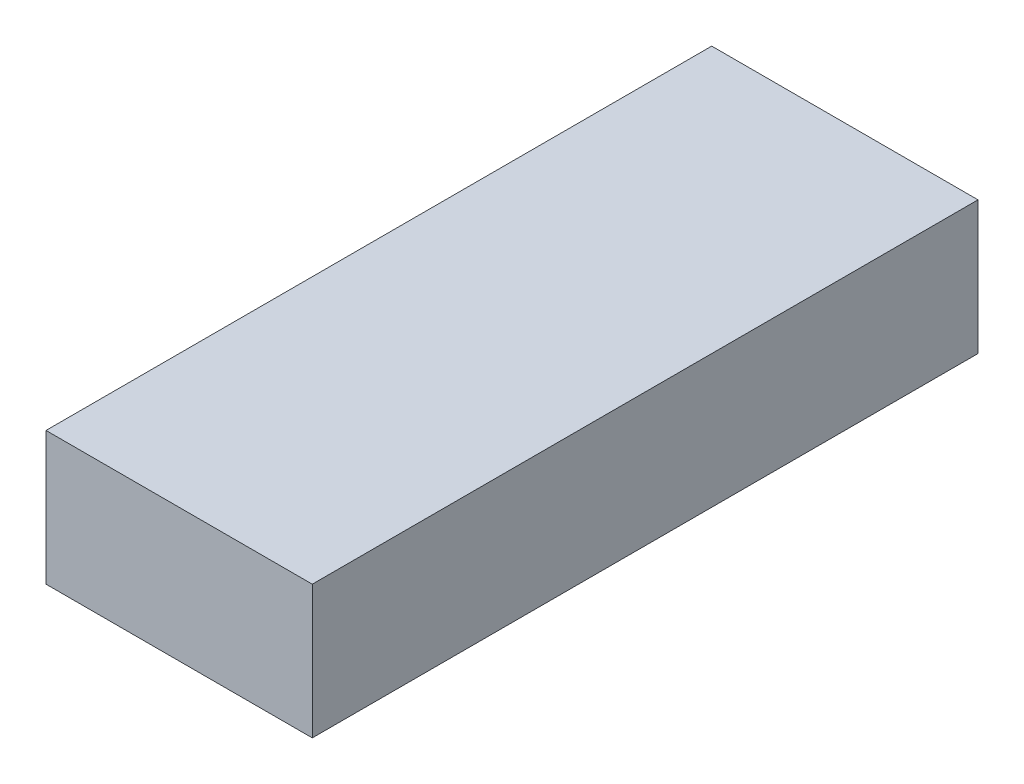
ISO-10303-21;
HEADER;
FILE_DESCRIPTION(('STEP AP214'),'2;1');
FILE_NAME('part.step','',(''),(''),'','','');
FILE_SCHEMA(('AUTOMOTIVE_DESIGN { 1 0 10303 214 1 1 1 1 }'));
ENDSEC;
DATA;
#1=APPLICATION_CONTEXT('core data for automotive mechanical design processes');
#2=APPLICATION_PROTOCOL_DEFINITION('international standard','automotive_design',2000,#1);
#3=PRODUCT_CONTEXT('',#1,'mechanical');
#4=PRODUCT('Part','Part','',(#3));
#5=PRODUCT_RELATED_PRODUCT_CATEGORY('part','',(#4));
#6=PRODUCT_DEFINITION_FORMATION('','',#4);
#7=PRODUCT_DEFINITION_CONTEXT('part definition',#1,'design');
#8=PRODUCT_DEFINITION('design','',#6,#7);
#9=PRODUCT_DEFINITION_SHAPE('','',#8);
#10=(LENGTH_UNIT() NAMED_UNIT(*) SI_UNIT(.MILLI.,.METRE.));
#11=(NAMED_UNIT(*) PLANE_ANGLE_UNIT() SI_UNIT($,.RADIAN.));
#12=(NAMED_UNIT(*) SI_UNIT($,.STERADIAN.) SOLID_ANGLE_UNIT());
#13=UNCERTAINTY_MEASURE_WITH_UNIT(LENGTH_MEASURE(1.E-05),#10,'distance_accuracy_value','');
#14=(GEOMETRIC_REPRESENTATION_CONTEXT(3) GLOBAL_UNCERTAINTY_ASSIGNED_CONTEXT((#13)) GLOBAL_UNIT_ASSIGNED_CONTEXT((#10,
#11,#12)) REPRESENTATION_CONTEXT('',''));
#15=CARTESIAN_POINT('',(0.,0.,0.));
#16=DIRECTION('',(0.,0.,1.));
#17=DIRECTION('',(1.,0.,0.));
#18=AXIS2_PLACEMENT_3D('',#15,#16,#17);
#19=CARTESIAN_POINT('',(-1.11022302462516E-13,6.34999999999999,0.));
#20=DIRECTION('',(1.,0.,0.));
#21=DIRECTION('',(0.,0.,-1.));
#22=AXIS2_PLACEMENT_3D('',#19,#20,#21);
#23=PLANE('',#22);
#24=DIRECTION('',(0.,0.,1.));
#25=VECTOR('',#24,1.);
#26=CARTESIAN_POINT('',(0.,0.,0.));
#27=LINE('',#26,#25);
#28=CARTESIAN_POINT('',(0.,0.,-304.8));
#29=VERTEX_POINT('',#28);
#30=CARTESIAN_POINT('',(0.,0.,-273.05));
#31=VERTEX_POINT('',#30);
#32=EDGE_CURVE('E99',#29,#31,#27,.T.);
#33=ORIENTED_EDGE('',*,*,#32,.T.);
#34=DIRECTION('',(0.,1.,0.));
#35=VECTOR('',#34,1.);
#36=CARTESIAN_POINT('',(0.,0.,-273.05));
#37=LINE('',#36,#35);
#38=CARTESIAN_POINT('',(0.,6.34999999999999,-273.05));
#39=VERTEX_POINT('',#38);
#40=EDGE_CURVE('E48',#31,#39,#37,.T.);
#41=ORIENTED_EDGE('',*,*,#40,.T.);
#42=DIRECTION('',(0.,0.,1.));
#43=VECTOR('',#42,1.);
#44=CARTESIAN_POINT('',(-1.11022302462516E-13,6.34999999999999,0.));
#45=LINE('',#44,#43);
#46=CARTESIAN_POINT('',(0.,6.34999999999999,-304.8));
#47=VERTEX_POINT('',#46);
#48=EDGE_CURVE('E101',#47,#39,#45,.T.);
#49=ORIENTED_EDGE('',*,*,#48,.F.);
#50=DIRECTION('',(0.,-1.,0.));
#51=VECTOR('',#50,1.);
#52=CARTESIAN_POINT('',(0.,6.34999999999999,-304.8));
#53=LINE('',#52,#51);
#54=EDGE_CURVE('E11',#47,#29,#53,.T.);
#55=ORIENTED_EDGE('',*,*,#54,.T.);
#56=EDGE_LOOP('',(#33,#41,#49,#55));
#57=FACE_BOUND('',#56,.T.);
#58=ADVANCED_FACE('F34',(#57),#23,.F.);
#59=CARTESIAN_POINT('',(0.,6.34999999999999,-304.8));
#60=DIRECTION('',(0.,0.,1.));
#61=DIRECTION('',(1.,0.,0.));
#62=AXIS2_PLACEMENT_3D('',#59,#60,#61);
#63=PLANE('',#62);
#64=DIRECTION('',(-1.,0.,0.));
#65=VECTOR('',#64,1.);
#66=CARTESIAN_POINT('',(0.,6.34999999999999,-304.8));
#67=LINE('',#66,#65);
#68=CARTESIAN_POINT('',(12.7,6.34999999999999,-304.8));
#69=VERTEX_POINT('',#68);
#70=EDGE_CURVE('E41',#69,#47,#67,.T.);
#71=ORIENTED_EDGE('',*,*,#70,.F.);
#72=DIRECTION('',(0.,1.,0.));
#73=VECTOR('',#72,1.);
#74=CARTESIAN_POINT('',(12.7,0.,-304.8));
#75=LINE('',#74,#73);
#76=CARTESIAN_POINT('',(12.7,0.,-304.8));
#77=VERTEX_POINT('',#76);
#78=EDGE_CURVE('E97',#77,#69,#75,.T.);
#79=ORIENTED_EDGE('',*,*,#78,.F.);
#80=DIRECTION('',(-1.,0.,0.));
#81=VECTOR('',#80,1.);
#82=CARTESIAN_POINT('',(0.,0.,-304.8));
#83=LINE('',#82,#81);
#84=EDGE_CURVE('E91',#77,#29,#83,.T.);
#85=ORIENTED_EDGE('',*,*,#84,.T.);
#86=ORIENTED_EDGE('',*,*,#54,.F.);
#87=EDGE_LOOP('',(#71,#79,#85,#86));
#88=FACE_BOUND('',#87,.T.);
#89=ADVANCED_FACE('F105',(#88),#63,.F.);
#90=CARTESIAN_POINT('',(-1.11022302462516E-13,6.34999999999999,0.));
#91=DIRECTION('',(0.,-1.,0.));
#92=DIRECTION('',(0.,0.,-1.));
#93=AXIS2_PLACEMENT_3D('',#90,#91,#92);
#94=PLANE('',#93);
#95=DIRECTION('',(-1.,0.,0.));
#96=VECTOR('',#95,1.);
#97=CARTESIAN_POINT('',(12.7,6.34999999999999,-273.05));
#98=LINE('',#97,#96);
#99=CARTESIAN_POINT('',(12.7,6.34999999999999,-273.05));
#100=VERTEX_POINT('',#99);
#101=EDGE_CURVE('E92',#100,#39,#98,.T.);
#102=ORIENTED_EDGE('',*,*,#101,.F.);
#103=DIRECTION('',(0.,0.,1.));
#104=VECTOR('',#103,1.);
#105=CARTESIAN_POINT('',(12.7,6.34999999999999,-304.8));
#106=LINE('',#105,#104);
#107=EDGE_CURVE('E80',#69,#100,#106,.T.);
#108=ORIENTED_EDGE('',*,*,#107,.F.);
#109=ORIENTED_EDGE('',*,*,#70,.T.);
#110=ORIENTED_EDGE('',*,*,#48,.T.);
#111=EDGE_LOOP('',(#102,#108,#109,#110));
#112=FACE_BOUND('',#111,.T.);
#113=ADVANCED_FACE('F108',(#112),#94,.F.);
#114=CARTESIAN_POINT('',(0.,0.,0.));
#115=DIRECTION('',(0.,-1.,0.));
#116=DIRECTION('',(0.,0.,-1.));
#117=AXIS2_PLACEMENT_3D('',#114,#115,#116);
#118=PLANE('',#117);
#119=DIRECTION('',(0.,0.,1.));
#120=VECTOR('',#119,1.);
#121=CARTESIAN_POINT('',(12.7,0.,-304.8));
#122=LINE('',#121,#120);
#123=CARTESIAN_POINT('',(12.7,0.,-273.05));
#124=VERTEX_POINT('',#123);
#125=EDGE_CURVE('E78',#77,#124,#122,.T.);
#126=ORIENTED_EDGE('',*,*,#125,.T.);
#127=DIRECTION('',(-1.,0.,0.));
#128=VECTOR('',#127,1.);
#129=CARTESIAN_POINT('',(12.7,0.,-273.05));
#130=LINE('',#129,#128);
#131=EDGE_CURVE('E82',#124,#31,#130,.T.);
#132=ORIENTED_EDGE('',*,*,#131,.T.);
#133=ORIENTED_EDGE('',*,*,#32,.F.);
#134=ORIENTED_EDGE('',*,*,#84,.F.);
#135=EDGE_LOOP('',(#126,#132,#133,#134));
#136=FACE_BOUND('',#135,.T.);
#137=ADVANCED_FACE('F90',(#136),#118,.T.);
#138=CARTESIAN_POINT('',(12.7,0.,-304.8));
#139=DIRECTION('',(-1.,0.,0.));
#140=DIRECTION('',(0.,0.,1.));
#141=AXIS2_PLACEMENT_3D('',#138,#139,#140);
#142=PLANE('',#141);
#143=ORIENTED_EDGE('',*,*,#107,.T.);
#144=DIRECTION('',(0.,1.,0.));
#145=VECTOR('',#144,1.);
#146=CARTESIAN_POINT('',(12.7,0.,-273.05));
#147=LINE('',#146,#145);
#148=EDGE_CURVE('E75',#124,#100,#147,.T.);
#149=ORIENTED_EDGE('',*,*,#148,.F.);
#150=ORIENTED_EDGE('',*,*,#125,.F.);
#151=ORIENTED_EDGE('',*,*,#78,.T.);
#152=EDGE_LOOP('',(#143,#149,#150,#151));
#153=FACE_BOUND('',#152,.T.);
#154=ADVANCED_FACE('F76',(#153),#142,.F.);
#155=CARTESIAN_POINT('',(12.7,0.,-273.05));
#156=DIRECTION('',(0.,0.,-1.));
#157=DIRECTION('',(-1.,0.,0.));
#158=AXIS2_PLACEMENT_3D('',#155,#156,#157);
#159=PLANE('',#158);
#160=ORIENTED_EDGE('',*,*,#101,.T.);
#161=ORIENTED_EDGE('',*,*,#40,.F.);
#162=ORIENTED_EDGE('',*,*,#131,.F.);
#163=ORIENTED_EDGE('',*,*,#148,.T.);
#164=EDGE_LOOP('',(#160,#161,#162,#163));
#165=FACE_BOUND('',#164,.T.);
#166=ADVANCED_FACE('F84',(#165),#159,.F.);
#167=CLOSED_SHELL('',(#58,#89,#113,#137,#154,#166));
#168=MANIFOLD_SOLID_BREP('B2',#167);
#169=ADVANCED_BREP_SHAPE_REPRESENTATION('',(#18,#168),#14);
#170=SHAPE_DEFINITION_REPRESENTATION(#9,#169);
ENDSEC;
END-ISO-10303-21;
